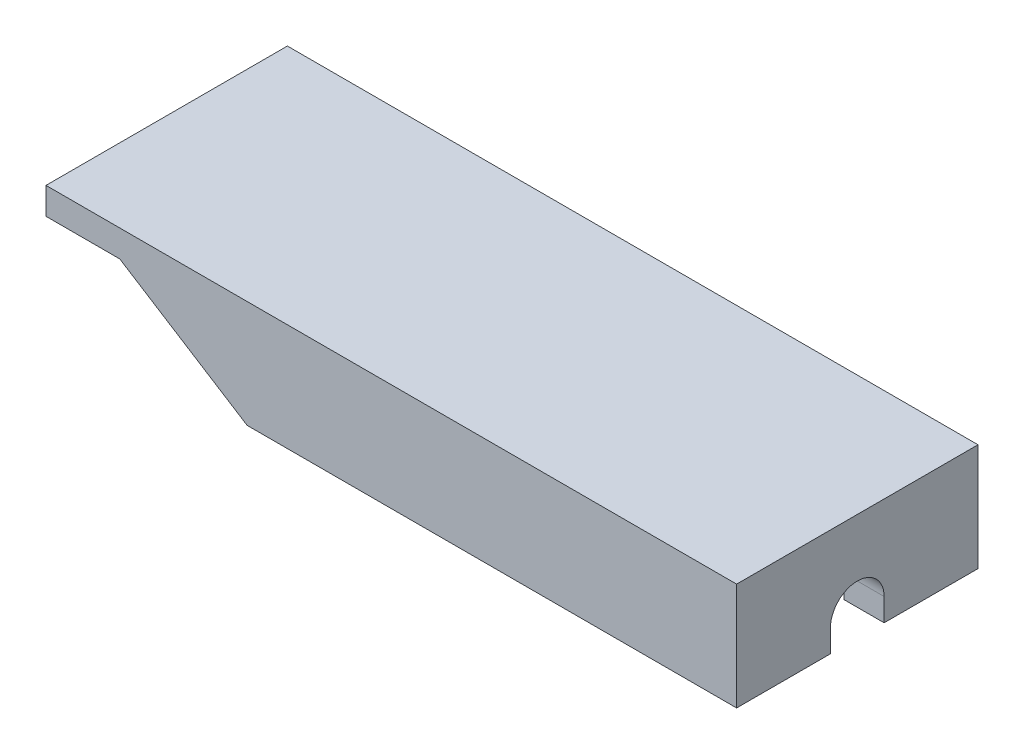
ISO-10303-21;
HEADER;
FILE_DESCRIPTION(('STEP AP214'),'2;1');
FILE_NAME('part.step','',(''),(''),'','','');
FILE_SCHEMA(('AUTOMOTIVE_DESIGN { 1 0 10303 214 1 1 1 1 }'));
ENDSEC;
DATA;
#1=APPLICATION_CONTEXT('core data for automotive mechanical design processes');
#2=APPLICATION_PROTOCOL_DEFINITION('international standard','automotive_design',2000,#1);
#3=PRODUCT_CONTEXT('',#1,'mechanical');
#4=PRODUCT('Part','Part','',(#3));
#5=PRODUCT_RELATED_PRODUCT_CATEGORY('part','',(#4));
#6=PRODUCT_DEFINITION_FORMATION('','',#4);
#7=PRODUCT_DEFINITION_CONTEXT('part definition',#1,'design');
#8=PRODUCT_DEFINITION('design','',#6,#7);
#9=PRODUCT_DEFINITION_SHAPE('','',#8);
#10=(LENGTH_UNIT() NAMED_UNIT(*) SI_UNIT(.MILLI.,.METRE.));
#11=(NAMED_UNIT(*) PLANE_ANGLE_UNIT() SI_UNIT($,.RADIAN.));
#12=(NAMED_UNIT(*) SI_UNIT($,.STERADIAN.) SOLID_ANGLE_UNIT());
#13=UNCERTAINTY_MEASURE_WITH_UNIT(LENGTH_MEASURE(1.E-05),#10,'distance_accuracy_value','');
#14=(GEOMETRIC_REPRESENTATION_CONTEXT(3) GLOBAL_UNCERTAINTY_ASSIGNED_CONTEXT((#13)) GLOBAL_UNIT_ASSIGNED_CONTEXT((#10,
#11,#12)) REPRESENTATION_CONTEXT('',''));
#15=CARTESIAN_POINT('',(0.,0.,0.));
#16=DIRECTION('',(0.,0.,1.));
#17=DIRECTION('',(1.,0.,0.));
#18=AXIS2_PLACEMENT_3D('',#15,#16,#17);
#19=CARTESIAN_POINT('',(51.5,-7.99999999999999,9.));
#20=DIRECTION('',(0.,1.,0.));
#21=DIRECTION('',(-1.,0.,0.));
#22=AXIS2_PLACEMENT_3D('',#19,#20,#21);
#23=PLANE('',#22);
#24=DIRECTION('',(0.,0.,-1.));
#25=VECTOR('',#24,1.);
#26=CARTESIAN_POINT('',(51.5,-7.99999999999999,9.));
#27=LINE('',#26,#25);
#28=CARTESIAN_POINT('',(51.5,-7.99999999999999,-2.));
#29=VERTEX_POINT('',#28);
#30=CARTESIAN_POINT('',(51.5,-7.99999999999999,-9.));
#31=VERTEX_POINT('',#30);
#32=EDGE_CURVE('E262',#29,#31,#27,.T.);
#33=ORIENTED_EDGE('',*,*,#32,.F.);
#34=DIRECTION('',(1.,0.,0.));
#35=VECTOR('',#34,1.);
#36=CARTESIAN_POINT('',(-0.001000000000001,-7.99999999999999,-2.));
#37=LINE('',#36,#35);
#38=CARTESIAN_POINT('',(48.5,-7.99999999999999,-2.));
#39=VERTEX_POINT('',#38);
#40=EDGE_CURVE('E179',#39,#29,#37,.T.);
#41=ORIENTED_EDGE('',*,*,#40,.F.);
#42=DIRECTION('',(0.,0.,1.));
#43=VECTOR('',#42,1.);
#44=CARTESIAN_POINT('',(48.5,-7.99999999999999,-6.));
#45=LINE('',#44,#43);
#46=CARTESIAN_POINT('',(48.5,-7.99999999999999,-6.));
#47=VERTEX_POINT('',#46);
#48=EDGE_CURVE('E193',#47,#39,#45,.T.);
#49=ORIENTED_EDGE('',*,*,#48,.F.);
#50=DIRECTION('',(-1.,0.,0.));
#51=VECTOR('',#50,1.);
#52=CARTESIAN_POINT('',(51.5,-7.99999999999999,-6.));
#53=LINE('',#52,#51);
#54=CARTESIAN_POINT('',(15.,-7.99999999999999,-6.));
#55=VERTEX_POINT('',#54);
#56=EDGE_CURVE('E50',#47,#55,#53,.T.);
#57=ORIENTED_EDGE('',*,*,#56,.T.);
#58=DIRECTION('',(0.,0.,-1.));
#59=VECTOR('',#58,1.);
#60=CARTESIAN_POINT('',(15.,-7.99999999999999,9.));
#61=LINE('',#60,#59);
#62=CARTESIAN_POINT('',(15.,-7.99999999999999,-9.));
#63=VERTEX_POINT('',#62);
#64=EDGE_CURVE('E267',#55,#63,#61,.T.);
#65=ORIENTED_EDGE('',*,*,#64,.T.);
#66=DIRECTION('',(1.,0.,0.));
#67=VECTOR('',#66,1.);
#68=CARTESIAN_POINT('',(51.5,-7.99999999999999,-9.));
#69=LINE('',#68,#67);
#70=EDGE_CURVE('E246',#63,#31,#69,.T.);
#71=ORIENTED_EDGE('',*,*,#70,.T.);
#72=EDGE_LOOP('',(#33,#41,#49,#57,#65,#71));
#73=FACE_BOUND('',#72,.T.);
#74=ADVANCED_FACE('F41',(#73),#23,.F.);
#75=CARTESIAN_POINT('',(0.,-2.,9.));
#76=DIRECTION('',(1.,0.,0.));
#77=DIRECTION('',(0.,0.,-1.));
#78=AXIS2_PLACEMENT_3D('',#75,#76,#77);
#79=PLANE('',#78);
#80=DIRECTION('',(0.,-1.,0.));
#81=VECTOR('',#80,1.);
#82=CARTESIAN_POINT('',(0.,-2.,-9.));
#83=LINE('',#82,#81);
#84=CARTESIAN_POINT('',(0.,0.,-9.));
#85=VERTEX_POINT('',#84);
#86=CARTESIAN_POINT('',(0.,-2.,-9.));
#87=VERTEX_POINT('',#86);
#88=EDGE_CURVE('E214',#85,#87,#83,.T.);
#89=ORIENTED_EDGE('',*,*,#88,.T.);
#90=DIRECTION('',(0.,0.,-1.));
#91=VECTOR('',#90,1.);
#92=CARTESIAN_POINT('',(0.,-2.,9.));
#93=LINE('',#92,#91);
#94=CARTESIAN_POINT('',(0.,-2.,9.));
#95=VERTEX_POINT('',#94);
#96=EDGE_CURVE('E276',#95,#87,#93,.T.);
#97=ORIENTED_EDGE('',*,*,#96,.F.);
#98=DIRECTION('',(0.,-1.,0.));
#99=VECTOR('',#98,1.);
#100=CARTESIAN_POINT('',(0.,-2.,9.));
#101=LINE('',#100,#99);
#102=CARTESIAN_POINT('',(0.,0.,9.));
#103=VERTEX_POINT('',#102);
#104=EDGE_CURVE('E215',#103,#95,#101,.T.);
#105=ORIENTED_EDGE('',*,*,#104,.F.);
#106=DIRECTION('',(0.,0.,-1.));
#107=VECTOR('',#106,1.);
#108=CARTESIAN_POINT('',(0.,0.,9.));
#109=LINE('',#108,#107);
#110=EDGE_CURVE('E235',#103,#85,#109,.T.);
#111=ORIENTED_EDGE('',*,*,#110,.T.);
#112=EDGE_LOOP('',(#89,#97,#105,#111));
#113=FACE_BOUND('',#112,.T.);
#114=ADVANCED_FACE('F43',(#113),#79,.F.);
#115=CARTESIAN_POINT('',(5.5,-2.,9.));
#116=DIRECTION('',(0.,1.,0.));
#117=DIRECTION('',(-1.,0.,0.));
#118=AXIS2_PLACEMENT_3D('',#115,#116,#117);
#119=PLANE('',#118);
#120=DIRECTION('',(1.,0.,0.));
#121=VECTOR('',#120,1.);
#122=CARTESIAN_POINT('',(5.5,-2.,-9.));
#123=LINE('',#122,#121);
#124=CARTESIAN_POINT('',(5.5,-2.,-9.));
#125=VERTEX_POINT('',#124);
#126=EDGE_CURVE('E239',#87,#125,#123,.T.);
#127=ORIENTED_EDGE('',*,*,#126,.T.);
#128=DIRECTION('',(0.,0.,-1.));
#129=VECTOR('',#128,1.);
#130=CARTESIAN_POINT('',(5.5,-2.,9.));
#131=LINE('',#130,#129);
#132=CARTESIAN_POINT('',(5.5,-2.,9.));
#133=VERTEX_POINT('',#132);
#134=EDGE_CURVE('E272',#133,#125,#131,.T.);
#135=ORIENTED_EDGE('',*,*,#134,.F.);
#136=DIRECTION('',(1.,0.,0.));
#137=VECTOR('',#136,1.);
#138=CARTESIAN_POINT('',(5.5,-2.,9.));
#139=LINE('',#138,#137);
#140=EDGE_CURVE('E219',#95,#133,#139,.T.);
#141=ORIENTED_EDGE('',*,*,#140,.F.);
#142=ORIENTED_EDGE('',*,*,#96,.T.);
#143=EDGE_LOOP('',(#127,#135,#141,#142));
#144=FACE_BOUND('',#143,.T.);
#145=ADVANCED_FACE('F325',(#144),#119,.F.);
#146=CARTESIAN_POINT('',(15.,-7.99999999999999,9.));
#147=DIRECTION('',(0.533992991387981,0.845488903030971,0.));
#148=DIRECTION('',(-0.845488903030971,0.533992991387982,0.));
#149=AXIS2_PLACEMENT_3D('',#146,#147,#148);
#150=PLANE('',#149);
#151=ORIENTED_EDGE('',*,*,#64,.F.);
#152=DIRECTION('',(-0.845488903030971,0.533992991387982,0.));
#153=VECTOR('',#152,1.);
#154=CARTESIAN_POINT('',(15.,-7.99999999999999,-6.));
#155=LINE('',#154,#153);
#156=CARTESIAN_POINT('',(7.08333333333334,-3.,-6.));
#157=VERTEX_POINT('',#156);
#158=EDGE_CURVE('E210',#55,#157,#155,.T.);
#159=ORIENTED_EDGE('',*,*,#158,.T.);
#160=DIRECTION('',(0.,0.,-1.));
#161=VECTOR('',#160,1.);
#162=CARTESIAN_POINT('',(7.08333333333334,-3.,9.));
#163=LINE('',#162,#161);
#164=CARTESIAN_POINT('',(7.08333333333334,-3.,6.));
#165=VERTEX_POINT('',#164);
#166=EDGE_CURVE('E12',#165,#157,#163,.T.);
#167=ORIENTED_EDGE('',*,*,#166,.F.);
#168=DIRECTION('',(0.845488903030971,-0.533992991387982,0.));
#169=VECTOR('',#168,1.);
#170=CARTESIAN_POINT('',(15.,-7.99999999999999,6.));
#171=LINE('',#170,#169);
#172=CARTESIAN_POINT('',(15.,-7.99999999999999,6.));
#173=VERTEX_POINT('',#172);
#174=EDGE_CURVE('E206',#165,#173,#171,.T.);
#175=ORIENTED_EDGE('',*,*,#174,.T.);
#176=CARTESIAN_POINT('',(15.,-7.99999999999999,9.));
#177=VERTEX_POINT('',#176);
#178=EDGE_CURVE('E268',#177,#173,#61,.T.);
#179=ORIENTED_EDGE('',*,*,#178,.F.);
#180=DIRECTION('',(0.845488903030971,-0.533992991387981,0.));
#181=VECTOR('',#180,1.);
#182=CARTESIAN_POINT('',(15.,-7.99999999999999,9.));
#183=LINE('',#182,#181);
#184=EDGE_CURVE('E223',#133,#177,#183,.T.);
#185=ORIENTED_EDGE('',*,*,#184,.F.);
#186=ORIENTED_EDGE('',*,*,#134,.T.);
#187=DIRECTION('',(0.845488903030971,-0.533992991387981,0.));
#188=VECTOR('',#187,1.);
#189=CARTESIAN_POINT('',(15.,-7.99999999999999,-9.));
#190=LINE('',#189,#188);
#191=EDGE_CURVE('E242',#125,#63,#190,.T.);
#192=ORIENTED_EDGE('',*,*,#191,.T.);
#193=EDGE_LOOP('',(#151,#159,#167,#175,#179,#185,#186,#192));
#194=FACE_BOUND('',#193,.T.);
#195=ADVANCED_FACE('F288',(#194),#150,.F.);
#196=CARTESIAN_POINT('',(48.5,-7.99999999999999,2.));
#197=VERTEX_POINT('',#196);
#198=CARTESIAN_POINT('',(48.5,-7.99999999999999,6.));
#199=VERTEX_POINT('',#198);
#200=EDGE_CURVE('E159',#197,#199,#45,.T.);
#201=ORIENTED_EDGE('',*,*,#200,.F.);
#202=DIRECTION('',(1.,0.,0.));
#203=VECTOR('',#202,1.);
#204=CARTESIAN_POINT('',(-0.001000000000001,-7.99999999999999,2.));
#205=LINE('',#204,#203);
#206=CARTESIAN_POINT('',(51.5,-7.99999999999999,2.));
#207=VERTEX_POINT('',#206);
#208=EDGE_CURVE('E57',#197,#207,#205,.T.);
#209=ORIENTED_EDGE('',*,*,#208,.T.);
#210=CARTESIAN_POINT('',(51.5,-7.99999999999999,9.));
#211=VERTEX_POINT('',#210);
#212=EDGE_CURVE('E263',#211,#207,#27,.T.);
#213=ORIENTED_EDGE('',*,*,#212,.F.);
#214=DIRECTION('',(1.,0.,0.));
#215=VECTOR('',#214,1.);
#216=CARTESIAN_POINT('',(51.5,-7.99999999999999,9.));
#217=LINE('',#216,#215);
#218=EDGE_CURVE('E226',#177,#211,#217,.T.);
#219=ORIENTED_EDGE('',*,*,#218,.F.);
#220=ORIENTED_EDGE('',*,*,#178,.T.);
#221=DIRECTION('',(-1.,0.,0.));
#222=VECTOR('',#221,1.);
#223=CARTESIAN_POINT('',(5.5,-7.99999999999999,6.));
#224=LINE('',#223,#222);
#225=EDGE_CURVE('E196',#199,#173,#224,.T.);
#226=ORIENTED_EDGE('',*,*,#225,.F.);
#227=EDGE_LOOP('',(#201,#209,#213,#219,#220,#226));
#228=FACE_BOUND('',#227,.T.);
#229=ADVANCED_FACE('F302',(#228),#23,.F.);
#230=CARTESIAN_POINT('',(51.5,0.,9.));
#231=DIRECTION('',(-1.,0.,0.));
#232=DIRECTION('',(0.,0.,1.));
#233=AXIS2_PLACEMENT_3D('',#230,#231,#232);
#234=PLANE('',#233);
#235=CARTESIAN_POINT('',(51.5,-6.29999999999999,0.));
#236=DIRECTION('',(1.,0.,0.));
#237=DIRECTION('',(0.,0.,1.));
#238=AXIS2_PLACEMENT_3D('',#235,#236,#237);
#239=CIRCLE('',#238,2.);
#240=CARTESIAN_POINT('',(51.5,-6.29999999999999,-2.));
#241=VERTEX_POINT('',#240);
#242=CARTESIAN_POINT('',(51.5,-6.29999999999999,2.));
#243=VERTEX_POINT('',#242);
#244=EDGE_CURVE('E150',#241,#243,#239,.T.);
#245=ORIENTED_EDGE('',*,*,#244,.F.);
#246=DIRECTION('',(0.,1.,0.));
#247=VECTOR('',#246,1.);
#248=CARTESIAN_POINT('',(51.5,-6.29999999999999,-2.));
#249=LINE('',#248,#247);
#250=EDGE_CURVE('E153',#29,#241,#249,.T.);
#251=ORIENTED_EDGE('',*,*,#250,.F.);
#252=ORIENTED_EDGE('',*,*,#32,.T.);
#253=DIRECTION('',(0.,1.,0.));
#254=VECTOR('',#253,1.);
#255=CARTESIAN_POINT('',(51.5,0.,-9.));
#256=LINE('',#255,#254);
#257=CARTESIAN_POINT('',(51.5,0.,-9.));
#258=VERTEX_POINT('',#257);
#259=EDGE_CURVE('E250',#31,#258,#256,.T.);
#260=ORIENTED_EDGE('',*,*,#259,.T.);
#261=DIRECTION('',(0.,0.,-1.));
#262=VECTOR('',#261,1.);
#263=CARTESIAN_POINT('',(51.5,0.,9.));
#264=LINE('',#263,#262);
#265=CARTESIAN_POINT('',(51.5,0.,9.));
#266=VERTEX_POINT('',#265);
#267=EDGE_CURVE('E258',#266,#258,#264,.T.);
#268=ORIENTED_EDGE('',*,*,#267,.F.);
#269=DIRECTION('',(0.,1.,0.));
#270=VECTOR('',#269,1.);
#271=CARTESIAN_POINT('',(51.5,0.,9.));
#272=LINE('',#271,#270);
#273=EDGE_CURVE('E229',#211,#266,#272,.T.);
#274=ORIENTED_EDGE('',*,*,#273,.F.);
#275=ORIENTED_EDGE('',*,*,#212,.T.);
#276=DIRECTION('',(0.,-1.,0.));
#277=VECTOR('',#276,1.);
#278=CARTESIAN_POINT('',(51.5,-7.99999999999999,2.));
#279=LINE('',#278,#277);
#280=EDGE_CURVE('E171',#243,#207,#279,.T.);
#281=ORIENTED_EDGE('',*,*,#280,.F.);
#282=EDGE_LOOP('',(#245,#251,#252,#260,#268,#274,#275,#281));
#283=FACE_BOUND('',#282,.T.);
#284=ADVANCED_FACE('F330',(#283),#234,.F.);
#285=CARTESIAN_POINT('',(0.,0.,9.));
#286=DIRECTION('',(0.,-1.,0.));
#287=DIRECTION('',(0.,0.,-1.));
#288=AXIS2_PLACEMENT_3D('',#285,#286,#287);
#289=PLANE('',#288);
#290=DIRECTION('',(-1.,0.,0.));
#291=VECTOR('',#290,1.);
#292=CARTESIAN_POINT('',(0.,0.,-9.));
#293=LINE('',#292,#291);
#294=EDGE_CURVE('E220',#258,#85,#293,.T.);
#295=ORIENTED_EDGE('',*,*,#294,.T.);
#296=ORIENTED_EDGE('',*,*,#110,.F.);
#297=DIRECTION('',(-1.,0.,0.));
#298=VECTOR('',#297,1.);
#299=CARTESIAN_POINT('',(0.,0.,9.));
#300=LINE('',#299,#298);
#301=EDGE_CURVE('E232',#266,#103,#300,.T.);
#302=ORIENTED_EDGE('',*,*,#301,.F.);
#303=ORIENTED_EDGE('',*,*,#267,.T.);
#304=EDGE_LOOP('',(#295,#296,#302,#303));
#305=FACE_BOUND('',#304,.T.);
#306=ADVANCED_FACE('F335',(#305),#289,.F.);
#307=CARTESIAN_POINT('',(0.,0.,9.));
#308=DIRECTION('',(0.,0.,-1.));
#309=DIRECTION('',(-1.,0.,0.));
#310=AXIS2_PLACEMENT_3D('',#307,#308,#309);
#311=PLANE('',#310);
#312=ORIENTED_EDGE('',*,*,#104,.T.);
#313=ORIENTED_EDGE('',*,*,#140,.T.);
#314=ORIENTED_EDGE('',*,*,#184,.T.);
#315=ORIENTED_EDGE('',*,*,#218,.T.);
#316=ORIENTED_EDGE('',*,*,#273,.T.);
#317=ORIENTED_EDGE('',*,*,#301,.T.);
#318=EDGE_LOOP('',(#312,#313,#314,#315,#316,#317));
#319=FACE_BOUND('',#318,.T.);
#320=ADVANCED_FACE('F368',(#319),#311,.F.);
#321=CARTESIAN_POINT('',(0.,0.,-9.));
#322=DIRECTION('',(0.,0.,-1.));
#323=DIRECTION('',(-1.,0.,0.));
#324=AXIS2_PLACEMENT_3D('',#321,#322,#323);
#325=PLANE('',#324);
#326=ORIENTED_EDGE('',*,*,#88,.F.);
#327=ORIENTED_EDGE('',*,*,#294,.F.);
#328=ORIENTED_EDGE('',*,*,#259,.F.);
#329=ORIENTED_EDGE('',*,*,#70,.F.);
#330=ORIENTED_EDGE('',*,*,#191,.F.);
#331=ORIENTED_EDGE('',*,*,#126,.F.);
#332=EDGE_LOOP('',(#326,#327,#328,#329,#330,#331));
#333=FACE_BOUND('',#332,.T.);
#334=ADVANCED_FACE('F318',(#333),#325,.T.);
#335=CARTESIAN_POINT('',(0.,-3.,9.));
#336=DIRECTION('',(0.,-1.,0.));
#337=DIRECTION('',(0.,0.,-1.));
#338=AXIS2_PLACEMENT_3D('',#335,#336,#337);
#339=PLANE('',#338);
#340=ORIENTED_EDGE('',*,*,#166,.T.);
#341=DIRECTION('',(-1.,0.,0.));
#342=VECTOR('',#341,1.);
#343=CARTESIAN_POINT('',(2.99999999999999,-3.,-6.));
#344=LINE('',#343,#342);
#345=CARTESIAN_POINT('',(48.5,-3.,-6.));
#346=VERTEX_POINT('',#345);
#347=EDGE_CURVE('E187',#346,#157,#344,.T.);
#348=ORIENTED_EDGE('',*,*,#347,.F.);
#349=DIRECTION('',(0.,0.,-1.));
#350=VECTOR('',#349,1.);
#351=CARTESIAN_POINT('',(48.5,-3.,-6.));
#352=LINE('',#351,#350);
#353=CARTESIAN_POINT('',(48.5,-3.,6.));
#354=VERTEX_POINT('',#353);
#355=EDGE_CURVE('E192',#354,#346,#352,.T.);
#356=ORIENTED_EDGE('',*,*,#355,.F.);
#357=DIRECTION('',(1.,0.,0.));
#358=VECTOR('',#357,1.);
#359=CARTESIAN_POINT('',(5.49999999999999,-3.,6.));
#360=LINE('',#359,#358);
#361=EDGE_CURVE('E184',#165,#354,#360,.T.);
#362=ORIENTED_EDGE('',*,*,#361,.F.);
#363=EDGE_LOOP('',(#340,#348,#356,#362));
#364=FACE_BOUND('',#363,.T.);
#365=ADVANCED_FACE('F308',(#364),#339,.T.);
#366=CARTESIAN_POINT('',(2.99999999999999,47.0558179187229,-6.));
#367=DIRECTION('',(0.,0.,-1.));
#368=DIRECTION('',(-1.,0.,0.));
#369=AXIS2_PLACEMENT_3D('',#366,#367,#368);
#370=PLANE('',#369);
#371=ORIENTED_EDGE('',*,*,#56,.F.);
#372=DIRECTION('',(0.,-1.,0.));
#373=VECTOR('',#372,1.);
#374=CARTESIAN_POINT('',(48.5,47.0558179187229,-6.));
#375=LINE('',#374,#373);
#376=EDGE_CURVE('E65',#346,#47,#375,.T.);
#377=ORIENTED_EDGE('',*,*,#376,.F.);
#378=ORIENTED_EDGE('',*,*,#347,.T.);
#379=ORIENTED_EDGE('',*,*,#158,.F.);
#380=EDGE_LOOP('',(#371,#377,#378,#379));
#381=FACE_BOUND('',#380,.T.);
#382=ADVANCED_FACE('F310',(#381),#370,.F.);
#383=CARTESIAN_POINT('',(5.49999999999999,47.0558179187229,6.));
#384=DIRECTION('',(0.,0.,1.));
#385=DIRECTION('',(1.,0.,0.));
#386=AXIS2_PLACEMENT_3D('',#383,#384,#385);
#387=PLANE('',#386);
#388=ORIENTED_EDGE('',*,*,#361,.T.);
#389=DIRECTION('',(0.,-1.,0.));
#390=VECTOR('',#389,1.);
#391=CARTESIAN_POINT('',(48.5,47.0558179187229,6.));
#392=LINE('',#391,#390);
#393=EDGE_CURVE('E188',#354,#199,#392,.T.);
#394=ORIENTED_EDGE('',*,*,#393,.T.);
#395=ORIENTED_EDGE('',*,*,#225,.T.);
#396=ORIENTED_EDGE('',*,*,#174,.F.);
#397=EDGE_LOOP('',(#388,#394,#395,#396));
#398=FACE_BOUND('',#397,.T.);
#399=ADVANCED_FACE('F300',(#398),#387,.F.);
#400=CARTESIAN_POINT('',(48.5,47.0558179187229,-6.));
#401=DIRECTION('',(1.,0.,0.));
#402=DIRECTION('',(0.,1.,0.));
#403=AXIS2_PLACEMENT_3D('',#400,#401,#402);
#404=PLANE('',#403);
#405=ORIENTED_EDGE('',*,*,#48,.T.);
#406=DIRECTION('',(0.,-1.,0.));
#407=VECTOR('',#406,1.);
#408=CARTESIAN_POINT('',(48.5,-6.29999999999998,-2.));
#409=LINE('',#408,#407);
#410=CARTESIAN_POINT('',(48.5,-6.29999999999999,-2.));
#411=VERTEX_POINT('',#410);
#412=EDGE_CURVE('E163',#411,#39,#409,.T.);
#413=ORIENTED_EDGE('',*,*,#412,.F.);
#414=CARTESIAN_POINT('',(48.5,-6.29999999999999,0.));
#415=DIRECTION('',(1.,0.,0.));
#416=DIRECTION('',(0.,1.,0.));
#417=AXIS2_PLACEMENT_3D('',#414,#415,#416);
#418=CIRCLE('',#417,2.);
#419=CARTESIAN_POINT('',(48.5,-6.29999999999999,2.));
#420=VERTEX_POINT('',#419);
#421=EDGE_CURVE('E147',#420,#411,#418,.F.);
#422=ORIENTED_EDGE('',*,*,#421,.F.);
#423=DIRECTION('',(0.,1.,0.));
#424=VECTOR('',#423,1.);
#425=CARTESIAN_POINT('',(48.5,-7.99999999999998,2.));
#426=LINE('',#425,#424);
#427=EDGE_CURVE('E155',#197,#420,#426,.T.);
#428=ORIENTED_EDGE('',*,*,#427,.F.);
#429=ORIENTED_EDGE('',*,*,#200,.T.);
#430=ORIENTED_EDGE('',*,*,#393,.F.);
#431=ORIENTED_EDGE('',*,*,#355,.T.);
#432=ORIENTED_EDGE('',*,*,#376,.T.);
#433=EDGE_LOOP('',(#405,#413,#422,#428,#429,#430,#431,#432));
#434=FACE_BOUND('',#433,.T.);
#435=ADVANCED_FACE('F162',(#434),#404,.F.);
#436=CARTESIAN_POINT('',(-0.001000000000001,-6.29999999999999,0.));
#437=DIRECTION('',(1.,0.,0.));
#438=DIRECTION('',(0.,0.,-1.));
#439=AXIS2_PLACEMENT_3D('',#436,#437,#438);
#440=CYLINDRICAL_SURFACE('',#439,2.);
#441=ORIENTED_EDGE('',*,*,#421,.T.);
#442=DIRECTION('',(1.,0.,0.));
#443=VECTOR('',#442,1.);
#444=CARTESIAN_POINT('',(-0.001000000000001,-6.29999999999999,-2.));
#445=LINE('',#444,#443);
#446=EDGE_CURVE('E160',#411,#241,#445,.T.);
#447=ORIENTED_EDGE('',*,*,#446,.T.);
#448=ORIENTED_EDGE('',*,*,#244,.T.);
#449=DIRECTION('',(1.,0.,0.));
#450=VECTOR('',#449,1.);
#451=CARTESIAN_POINT('',(-0.001000000000001,-6.29999999999999,2.));
#452=LINE('',#451,#450);
#453=EDGE_CURVE('E144',#420,#243,#452,.T.);
#454=ORIENTED_EDGE('',*,*,#453,.F.);
#455=EDGE_LOOP('',(#441,#447,#448,#454));
#456=FACE_BOUND('',#455,.T.);
#457=ADVANCED_FACE('F145',(#456),#440,.F.);
#458=CARTESIAN_POINT('',(-0.001000000000001,-6.29999999999999,-2.));
#459=DIRECTION('',(0.,0.,-1.));
#460=DIRECTION('',(0.,1.,0.));
#461=AXIS2_PLACEMENT_3D('',#458,#459,#460);
#462=PLANE('',#461);
#463=ORIENTED_EDGE('',*,*,#412,.T.);
#464=ORIENTED_EDGE('',*,*,#40,.T.);
#465=ORIENTED_EDGE('',*,*,#250,.T.);
#466=ORIENTED_EDGE('',*,*,#446,.F.);
#467=EDGE_LOOP('',(#463,#464,#465,#466));
#468=FACE_BOUND('',#467,.T.);
#469=ADVANCED_FACE('F352',(#468),#462,.F.);
#470=CARTESIAN_POINT('',(-0.001000000000001,-7.99999999999999,2.));
#471=DIRECTION('',(0.,0.,1.));
#472=DIRECTION('',(0.,-1.,0.));
#473=AXIS2_PLACEMENT_3D('',#470,#471,#472);
#474=PLANE('',#473);
#475=ORIENTED_EDGE('',*,*,#427,.T.);
#476=ORIENTED_EDGE('',*,*,#453,.T.);
#477=ORIENTED_EDGE('',*,*,#280,.T.);
#478=ORIENTED_EDGE('',*,*,#208,.F.);
#479=EDGE_LOOP('',(#475,#476,#477,#478));
#480=FACE_BOUND('',#479,.T.);
#481=ADVANCED_FACE('F156',(#480),#474,.F.);
#482=CLOSED_SHELL('',(#74,#114,#145,#195,#229,#284,#306,#320,#334,#365,#382,#399,#435,#457,#469,#481));
#483=MANIFOLD_SOLID_BREP('B2',#482);
#484=ADVANCED_BREP_SHAPE_REPRESENTATION('',(#18,#483),#14);
#485=SHAPE_DEFINITION_REPRESENTATION(#9,#484);
ENDSEC;
END-ISO-10303-21;
